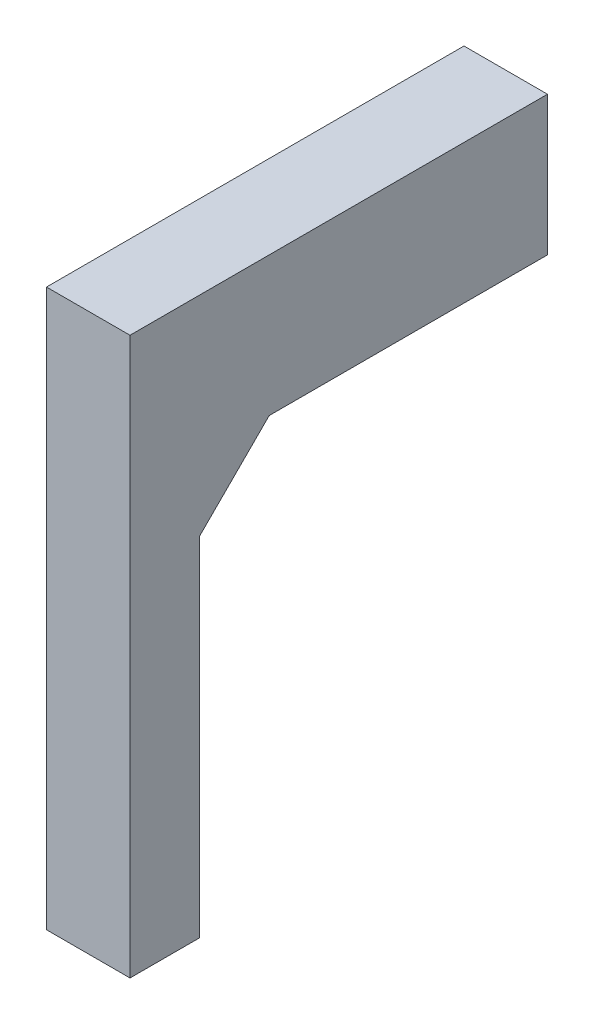
ISO-10303-21;
HEADER;
FILE_DESCRIPTION(('STEP AP214'),'2;1');
FILE_NAME('part.step','',(''),(''),'','','');
FILE_SCHEMA(('AUTOMOTIVE_DESIGN { 1 0 10303 214 1 1 1 1 }'));
ENDSEC;
DATA;
#1=APPLICATION_CONTEXT('core data for automotive mechanical design processes');
#2=APPLICATION_PROTOCOL_DEFINITION('international standard','automotive_design',2000,#1);
#3=PRODUCT_CONTEXT('',#1,'mechanical');
#4=PRODUCT('Part','Part','',(#3));
#5=PRODUCT_RELATED_PRODUCT_CATEGORY('part','',(#4));
#6=PRODUCT_DEFINITION_FORMATION('','',#4);
#7=PRODUCT_DEFINITION_CONTEXT('part definition',#1,'design');
#8=PRODUCT_DEFINITION('design','',#6,#7);
#9=PRODUCT_DEFINITION_SHAPE('','',#8);
#10=(LENGTH_UNIT() NAMED_UNIT(*) SI_UNIT(.MILLI.,.METRE.));
#11=(NAMED_UNIT(*) PLANE_ANGLE_UNIT() SI_UNIT($,.RADIAN.));
#12=(NAMED_UNIT(*) SI_UNIT($,.STERADIAN.) SOLID_ANGLE_UNIT());
#13=UNCERTAINTY_MEASURE_WITH_UNIT(LENGTH_MEASURE(1.E-05),#10,'distance_accuracy_value','');
#14=(GEOMETRIC_REPRESENTATION_CONTEXT(3) GLOBAL_UNCERTAINTY_ASSIGNED_CONTEXT((#13)) GLOBAL_UNIT_ASSIGNED_CONTEXT((#10,
#11,#12)) REPRESENTATION_CONTEXT('',''));
#15=CARTESIAN_POINT('',(0.,0.,0.));
#16=DIRECTION('',(0.,0.,1.));
#17=DIRECTION('',(1.,0.,0.));
#18=AXIS2_PLACEMENT_3D('',#15,#16,#17);
#19=CARTESIAN_POINT('',(30.,0.,0.));
#20=DIRECTION('',(0.,0.,1.));
#21=DIRECTION('',(0.,-1.,0.));
#22=AXIS2_PLACEMENT_3D('',#19,#20,#21);
#23=PLANE('',#22);
#24=DIRECTION('',(0.,1.,0.));
#25=VECTOR('',#24,1.);
#26=CARTESIAN_POINT('',(0.,0.,0.));
#27=LINE('',#26,#25);
#28=CARTESIAN_POINT('',(0.,-50.,0.));
#29=VERTEX_POINT('',#28);
#30=CARTESIAN_POINT('',(0.,0.,0.));
#31=VERTEX_POINT('',#30);
#32=EDGE_CURVE('E140',#29,#31,#27,.T.);
#33=ORIENTED_EDGE('',*,*,#32,.T.);
#34=DIRECTION('',(-1.,0.,0.));
#35=VECTOR('',#34,1.);
#36=CARTESIAN_POINT('',(30.,0.,0.));
#37=LINE('',#36,#35);
#38=CARTESIAN_POINT('',(30.,0.,0.));
#39=VERTEX_POINT('',#38);
#40=EDGE_CURVE('E11',#39,#31,#37,.T.);
#41=ORIENTED_EDGE('',*,*,#40,.F.);
#42=DIRECTION('',(0.,1.,0.));
#43=VECTOR('',#42,1.);
#44=CARTESIAN_POINT('',(30.,0.,0.));
#45=LINE('',#44,#43);
#46=CARTESIAN_POINT('',(30.,-50.,0.));
#47=VERTEX_POINT('',#46);
#48=EDGE_CURVE('E159',#47,#39,#45,.T.);
#49=ORIENTED_EDGE('',*,*,#48,.F.);
#50=DIRECTION('',(-1.,0.,0.));
#51=VECTOR('',#50,1.);
#52=CARTESIAN_POINT('',(30.,-50.,0.));
#53=LINE('',#52,#51);
#54=EDGE_CURVE('E136',#47,#29,#53,.T.);
#55=ORIENTED_EDGE('',*,*,#54,.T.);
#56=EDGE_LOOP('',(#33,#41,#49,#55));
#57=FACE_BOUND('',#56,.T.);
#58=ADVANCED_FACE('F45',(#57),#23,.F.);
#59=CARTESIAN_POINT('',(30.,0.,0.));
#60=DIRECTION('',(0.,-1.,0.));
#61=DIRECTION('',(0.,0.,-1.));
#62=AXIS2_PLACEMENT_3D('',#59,#60,#61);
#63=PLANE('',#62);
#64=DIRECTION('',(0.,0.,1.));
#65=VECTOR('',#64,1.);
#66=CARTESIAN_POINT('',(0.,0.,0.));
#67=LINE('',#66,#65);
#68=CARTESIAN_POINT('',(0.,0.,150.));
#69=VERTEX_POINT('',#68);
#70=EDGE_CURVE('E144',#31,#69,#67,.T.);
#71=ORIENTED_EDGE('',*,*,#70,.T.);
#72=DIRECTION('',(-1.,0.,0.));
#73=VECTOR('',#72,1.);
#74=CARTESIAN_POINT('',(30.,0.,150.));
#75=LINE('',#74,#73);
#76=CARTESIAN_POINT('',(30.,0.,150.));
#77=VERTEX_POINT('',#76);
#78=EDGE_CURVE('E54',#77,#69,#75,.T.);
#79=ORIENTED_EDGE('',*,*,#78,.F.);
#80=DIRECTION('',(0.,0.,1.));
#81=VECTOR('',#80,1.);
#82=CARTESIAN_POINT('',(30.,0.,0.));
#83=LINE('',#82,#81);
#84=EDGE_CURVE('E102',#39,#77,#83,.T.);
#85=ORIENTED_EDGE('',*,*,#84,.F.);
#86=ORIENTED_EDGE('',*,*,#40,.T.);
#87=EDGE_LOOP('',(#71,#79,#85,#86));
#88=FACE_BOUND('',#87,.T.);
#89=ADVANCED_FACE('F193',(#88),#63,.F.);
#90=CARTESIAN_POINT('',(30.,0.,150.));
#91=DIRECTION('',(0.,0.,-1.));
#92=DIRECTION('',(-1.,0.,0.));
#93=AXIS2_PLACEMENT_3D('',#90,#91,#92);
#94=PLANE('',#93);
#95=DIRECTION('',(0.,-1.,0.));
#96=VECTOR('',#95,1.);
#97=CARTESIAN_POINT('',(0.,0.,150.));
#98=LINE('',#97,#96);
#99=CARTESIAN_POINT('',(0.,-200.,150.));
#100=VERTEX_POINT('',#99);
#101=EDGE_CURVE('E147',#69,#100,#98,.T.);
#102=ORIENTED_EDGE('',*,*,#101,.T.);
#103=DIRECTION('',(-1.,0.,0.));
#104=VECTOR('',#103,1.);
#105=CARTESIAN_POINT('',(30.,-200.,150.));
#106=LINE('',#105,#104);
#107=CARTESIAN_POINT('',(30.,-200.,150.));
#108=VERTEX_POINT('',#107);
#109=EDGE_CURVE('E166',#108,#100,#106,.T.);
#110=ORIENTED_EDGE('',*,*,#109,.F.);
#111=DIRECTION('',(0.,-1.,0.));
#112=VECTOR('',#111,1.);
#113=CARTESIAN_POINT('',(30.,0.,150.));
#114=LINE('',#113,#112);
#115=EDGE_CURVE('E176',#77,#108,#114,.T.);
#116=ORIENTED_EDGE('',*,*,#115,.F.);
#117=ORIENTED_EDGE('',*,*,#78,.T.);
#118=EDGE_LOOP('',(#102,#110,#116,#117));
#119=FACE_BOUND('',#118,.T.);
#120=ADVANCED_FACE('F174',(#119),#94,.F.);
#121=CARTESIAN_POINT('',(30.,-200.,150.));
#122=DIRECTION('',(0.,1.,0.));
#123=DIRECTION('',(0.,0.,1.));
#124=AXIS2_PLACEMENT_3D('',#121,#122,#123);
#125=PLANE('',#124);
#126=DIRECTION('',(0.,0.,-1.));
#127=VECTOR('',#126,1.);
#128=CARTESIAN_POINT('',(0.,-200.,150.));
#129=LINE('',#128,#127);
#130=CARTESIAN_POINT('',(0.,-200.,125.));
#131=VERTEX_POINT('',#130);
#132=EDGE_CURVE('E150',#100,#131,#129,.T.);
#133=ORIENTED_EDGE('',*,*,#132,.T.);
#134=DIRECTION('',(-1.,0.,0.));
#135=VECTOR('',#134,1.);
#136=CARTESIAN_POINT('',(30.,-200.,125.));
#137=LINE('',#136,#135);
#138=CARTESIAN_POINT('',(30.,-200.,125.));
#139=VERTEX_POINT('',#138);
#140=EDGE_CURVE('E129',#139,#131,#137,.T.);
#141=ORIENTED_EDGE('',*,*,#140,.F.);
#142=DIRECTION('',(0.,0.,-1.));
#143=VECTOR('',#142,1.);
#144=CARTESIAN_POINT('',(30.,-200.,150.));
#145=LINE('',#144,#143);
#146=EDGE_CURVE('E118',#108,#139,#145,.T.);
#147=ORIENTED_EDGE('',*,*,#146,.F.);
#148=ORIENTED_EDGE('',*,*,#109,.T.);
#149=EDGE_LOOP('',(#133,#141,#147,#148));
#150=FACE_BOUND('',#149,.T.);
#151=ADVANCED_FACE('F182',(#150),#125,.F.);
#152=CARTESIAN_POINT('',(30.,-75.0000000000003,125.));
#153=DIRECTION('',(0.,0.,1.));
#154=DIRECTION('',(1.,0.,0.));
#155=AXIS2_PLACEMENT_3D('',#152,#153,#154);
#156=PLANE('',#155);
#157=DIRECTION('',(0.,1.,0.));
#158=VECTOR('',#157,1.);
#159=CARTESIAN_POINT('',(0.,-75.0000000000003,125.));
#160=LINE('',#159,#158);
#161=CARTESIAN_POINT('',(0.,-75.0000000000003,125.));
#162=VERTEX_POINT('',#161);
#163=EDGE_CURVE('E127',#131,#162,#160,.T.);
#164=ORIENTED_EDGE('',*,*,#163,.T.);
#165=DIRECTION('',(-1.,0.,0.));
#166=VECTOR('',#165,1.);
#167=CARTESIAN_POINT('',(30.,-75.0000000000003,125.));
#168=LINE('',#167,#166);
#169=CARTESIAN_POINT('',(30.,-75.0000000000003,125.));
#170=VERTEX_POINT('',#169);
#171=EDGE_CURVE('E124',#170,#162,#168,.T.);
#172=ORIENTED_EDGE('',*,*,#171,.F.);
#173=DIRECTION('',(0.,1.,0.));
#174=VECTOR('',#173,1.);
#175=CARTESIAN_POINT('',(30.,-75.0000000000003,125.));
#176=LINE('',#175,#174);
#177=EDGE_CURVE('E112',#139,#170,#176,.T.);
#178=ORIENTED_EDGE('',*,*,#177,.F.);
#179=ORIENTED_EDGE('',*,*,#140,.T.);
#180=EDGE_LOOP('',(#164,#172,#178,#179));
#181=FACE_BOUND('',#180,.T.);
#182=ADVANCED_FACE('F125',(#181),#156,.F.);
#183=CARTESIAN_POINT('',(30.,-50.,100.));
#184=DIRECTION('',(0.,0.707106781186544,0.707106781186551));
#185=DIRECTION('',(0.,-0.707106781186551,0.707106781186544));
#186=AXIS2_PLACEMENT_3D('',#183,#184,#185);
#187=PLANE('',#186);
#188=DIRECTION('',(0.,0.707106781186551,-0.707106781186544));
#189=VECTOR('',#188,1.);
#190=CARTESIAN_POINT('',(0.,-50.,100.));
#191=LINE('',#190,#189);
#192=CARTESIAN_POINT('',(0.,-50.,100.));
#193=VERTEX_POINT('',#192);
#194=EDGE_CURVE('E88',#162,#193,#191,.T.);
#195=ORIENTED_EDGE('',*,*,#194,.T.);
#196=DIRECTION('',(-1.,0.,0.));
#197=VECTOR('',#196,1.);
#198=CARTESIAN_POINT('',(30.,-50.,100.));
#199=LINE('',#198,#197);
#200=CARTESIAN_POINT('',(30.,-50.,100.));
#201=VERTEX_POINT('',#200);
#202=EDGE_CURVE('E130',#201,#193,#199,.T.);
#203=ORIENTED_EDGE('',*,*,#202,.F.);
#204=DIRECTION('',(0.,0.707106781186551,-0.707106781186544));
#205=VECTOR('',#204,1.);
#206=CARTESIAN_POINT('',(30.,-50.,100.));
#207=LINE('',#206,#205);
#208=EDGE_CURVE('E116',#170,#201,#207,.T.);
#209=ORIENTED_EDGE('',*,*,#208,.F.);
#210=ORIENTED_EDGE('',*,*,#171,.T.);
#211=EDGE_LOOP('',(#195,#203,#209,#210));
#212=FACE_BOUND('',#211,.T.);
#213=ADVANCED_FACE('F132',(#212),#187,.F.);
#214=CARTESIAN_POINT('',(30.,-50.,0.));
#215=DIRECTION('',(0.,1.,0.));
#216=DIRECTION('',(0.,0.,1.));
#217=AXIS2_PLACEMENT_3D('',#214,#215,#216);
#218=PLANE('',#217);
#219=DIRECTION('',(0.,0.,-1.));
#220=VECTOR('',#219,1.);
#221=CARTESIAN_POINT('',(0.,-50.,0.));
#222=LINE('',#221,#220);
#223=EDGE_CURVE('E94',#193,#29,#222,.T.);
#224=ORIENTED_EDGE('',*,*,#223,.T.);
#225=ORIENTED_EDGE('',*,*,#54,.F.);
#226=DIRECTION('',(0.,0.,-1.));
#227=VECTOR('',#226,1.);
#228=CARTESIAN_POINT('',(30.,-50.,0.));
#229=LINE('',#228,#227);
#230=EDGE_CURVE('E62',#201,#47,#229,.T.);
#231=ORIENTED_EDGE('',*,*,#230,.F.);
#232=ORIENTED_EDGE('',*,*,#202,.T.);
#233=EDGE_LOOP('',(#224,#225,#231,#232));
#234=FACE_BOUND('',#233,.T.);
#235=ADVANCED_FACE('F207',(#234),#218,.F.);
#236=CARTESIAN_POINT('',(30.,0.,0.));
#237=DIRECTION('',(-1.,0.,0.));
#238=DIRECTION('',(0.,0.,1.));
#239=AXIS2_PLACEMENT_3D('',#236,#237,#238);
#240=PLANE('',#239);
#241=ORIENTED_EDGE('',*,*,#48,.T.);
#242=ORIENTED_EDGE('',*,*,#84,.T.);
#243=ORIENTED_EDGE('',*,*,#115,.T.);
#244=ORIENTED_EDGE('',*,*,#146,.T.);
#245=ORIENTED_EDGE('',*,*,#177,.T.);
#246=ORIENTED_EDGE('',*,*,#208,.T.);
#247=ORIENTED_EDGE('',*,*,#230,.T.);
#248=EDGE_LOOP('',(#241,#242,#243,#244,#245,#246,#247));
#249=FACE_BOUND('',#248,.T.);
#250=ADVANCED_FACE('F114',(#249),#240,.F.);
#251=CARTESIAN_POINT('',(0.,0.,0.));
#252=DIRECTION('',(-1.,0.,0.));
#253=DIRECTION('',(0.,0.,1.));
#254=AXIS2_PLACEMENT_3D('',#251,#252,#253);
#255=PLANE('',#254);
#256=ORIENTED_EDGE('',*,*,#32,.F.);
#257=ORIENTED_EDGE('',*,*,#223,.F.);
#258=ORIENTED_EDGE('',*,*,#194,.F.);
#259=ORIENTED_EDGE('',*,*,#163,.F.);
#260=ORIENTED_EDGE('',*,*,#132,.F.);
#261=ORIENTED_EDGE('',*,*,#101,.F.);
#262=ORIENTED_EDGE('',*,*,#70,.F.);
#263=EDGE_LOOP('',(#256,#257,#258,#259,#260,#261,#262));
#264=FACE_BOUND('',#263,.T.);
#265=ADVANCED_FACE('F180',(#264),#255,.T.);
#266=CLOSED_SHELL('',(#58,#89,#120,#151,#182,#213,#235,#250,#265));
#267=MANIFOLD_SOLID_BREP('B2',#266);
#268=ADVANCED_BREP_SHAPE_REPRESENTATION('',(#18,#267),#14);
#269=SHAPE_DEFINITION_REPRESENTATION(#9,#268);
ENDSEC;
END-ISO-10303-21;
